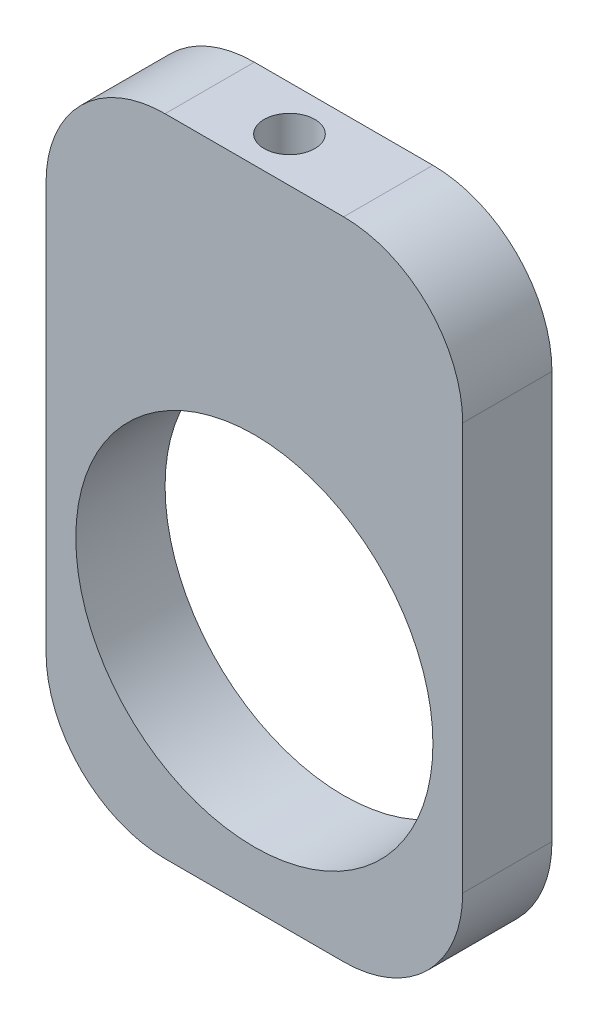
ISO-10303-21;
HEADER;
FILE_DESCRIPTION(('STEP AP214'),'2;1');
FILE_NAME('part.step','',(''),(''),'','','');
FILE_SCHEMA(('AUTOMOTIVE_DESIGN { 1 0 10303 214 1 1 1 1 }'));
ENDSEC;
DATA;
#1=APPLICATION_CONTEXT('core data for automotive mechanical design processes');
#2=APPLICATION_PROTOCOL_DEFINITION('international standard','automotive_design',2000,#1);
#3=PRODUCT_CONTEXT('',#1,'mechanical');
#4=PRODUCT('Part','Part','',(#3));
#5=PRODUCT_RELATED_PRODUCT_CATEGORY('part','',(#4));
#6=PRODUCT_DEFINITION_FORMATION('','',#4);
#7=PRODUCT_DEFINITION_CONTEXT('part definition',#1,'design');
#8=PRODUCT_DEFINITION('design','',#6,#7);
#9=PRODUCT_DEFINITION_SHAPE('','',#8);
#10=(LENGTH_UNIT() NAMED_UNIT(*) SI_UNIT(.MILLI.,.METRE.));
#11=(NAMED_UNIT(*) PLANE_ANGLE_UNIT() SI_UNIT($,.RADIAN.));
#12=(NAMED_UNIT(*) SI_UNIT($,.STERADIAN.) SOLID_ANGLE_UNIT());
#13=UNCERTAINTY_MEASURE_WITH_UNIT(LENGTH_MEASURE(1.E-05),#10,'distance_accuracy_value','');
#14=(GEOMETRIC_REPRESENTATION_CONTEXT(3) GLOBAL_UNCERTAINTY_ASSIGNED_CONTEXT((#13)) GLOBAL_UNIT_ASSIGNED_CONTEXT((#10,
#11,#12)) REPRESENTATION_CONTEXT('',''));
#15=CARTESIAN_POINT('',(0.,0.,0.));
#16=DIRECTION('',(0.,0.,1.));
#17=DIRECTION('',(1.,0.,0.));
#18=AXIS2_PLACEMENT_3D('',#15,#16,#17);
#19=CARTESIAN_POINT('',(0.,21.971,4.7625));
#20=DIRECTION('',(0.,-1.,0.));
#21=DIRECTION('',(1.,0.,0.));
#22=AXIS2_PLACEMENT_3D('',#19,#20,#21);
#23=PLANE('',#22);
#24=CARTESIAN_POINT('',(-0.508000000000001,21.971,2.38125));
#25=DIRECTION('',(0.,1.,0.));
#26=DIRECTION('',(0.,0.,1.));
#27=AXIS2_PLACEMENT_3D('',#24,#25,#26);
#28=CIRCLE('',#27,1.35255);
#29=CARTESIAN_POINT('',(-0.508000000000001,21.971,3.7338));
#30=VERTEX_POINT('',#29);
#31=EDGE_CURVE('E190',#30,#30,#28,.T.);
#32=ORIENTED_EDGE('',*,*,#31,.F.);
#33=EDGE_LOOP('',(#32));
#34=FACE_BOUND('',#33,.T.);
#35=DIRECTION('',(-1.,0.,0.));
#36=VECTOR('',#35,1.);
#37=CARTESIAN_POINT('',(0.,21.971,0.));
#38=LINE('',#37,#36);
#39=CARTESIAN_POINT('',(4.7625,21.971,0.));
#40=VERTEX_POINT('',#39);
#41=CARTESIAN_POINT('',(-4.7625,21.971,0.));
#42=VERTEX_POINT('',#41);
#43=EDGE_CURVE('E139',#40,#42,#38,.T.);
#44=ORIENTED_EDGE('',*,*,#43,.T.);
#45=DIRECTION('',(0.,0.,-1.));
#46=VECTOR('',#45,1.);
#47=CARTESIAN_POINT('',(-4.7625,21.971,4.7625));
#48=LINE('',#47,#46);
#49=CARTESIAN_POINT('',(-4.7625,21.971,4.7625));
#50=VERTEX_POINT('',#49);
#51=EDGE_CURVE('E11',#50,#42,#48,.T.);
#52=ORIENTED_EDGE('',*,*,#51,.F.);
#53=DIRECTION('',(-1.,0.,0.));
#54=VECTOR('',#53,1.);
#55=CARTESIAN_POINT('',(0.,21.971,4.7625));
#56=LINE('',#55,#54);
#57=CARTESIAN_POINT('',(4.7625,21.971,4.7625));
#58=VERTEX_POINT('',#57);
#59=EDGE_CURVE('E158',#58,#50,#56,.T.);
#60=ORIENTED_EDGE('',*,*,#59,.F.);
#61=DIRECTION('',(0.,0.,-1.));
#62=VECTOR('',#61,1.);
#63=CARTESIAN_POINT('',(4.7625,21.971,4.7625));
#64=LINE('',#63,#62);
#65=EDGE_CURVE('E138',#58,#40,#64,.T.);
#66=ORIENTED_EDGE('',*,*,#65,.T.);
#67=EDGE_LOOP('',(#44,#52,#60,#66));
#68=FACE_BOUND('',#67,.T.);
#69=ADVANCED_FACE('F35',(#34,#68),#23,.F.);
#70=CARTESIAN_POINT('',(-4.7625,15.621,4.7625));
#71=DIRECTION('',(0.,0.,-1.));
#72=DIRECTION('',(-1.,0.,0.));
#73=AXIS2_PLACEMENT_3D('',#70,#71,#72);
#74=CYLINDRICAL_SURFACE('',#73,6.35);
#75=CARTESIAN_POINT('',(-4.7625,15.621,0.));
#76=DIRECTION('',(0.,0.,1.));
#77=DIRECTION('',(1.,0.,0.));
#78=AXIS2_PLACEMENT_3D('',#75,#76,#77);
#79=CIRCLE('',#78,6.35);
#80=CARTESIAN_POINT('',(-11.1125,15.621,0.));
#81=VERTEX_POINT('',#80);
#82=EDGE_CURVE('E142',#42,#81,#79,.T.);
#83=ORIENTED_EDGE('',*,*,#82,.T.);
#84=DIRECTION('',(0.,0.,-1.));
#85=VECTOR('',#84,1.);
#86=CARTESIAN_POINT('',(-11.1125,15.621,4.7625));
#87=LINE('',#86,#85);
#88=CARTESIAN_POINT('',(-11.1125,15.621,4.7625));
#89=VERTEX_POINT('',#88);
#90=EDGE_CURVE('E48',#89,#81,#87,.T.);
#91=ORIENTED_EDGE('',*,*,#90,.F.);
#92=CARTESIAN_POINT('',(-4.7625,15.621,4.7625));
#93=DIRECTION('',(0.,0.,1.));
#94=DIRECTION('',(1.,0.,0.));
#95=AXIS2_PLACEMENT_3D('',#92,#93,#94);
#96=CIRCLE('',#95,6.35);
#97=EDGE_CURVE('E99',#50,#89,#96,.T.);
#98=ORIENTED_EDGE('',*,*,#97,.F.);
#99=ORIENTED_EDGE('',*,*,#51,.T.);
#100=EDGE_LOOP('',(#83,#91,#98,#99));
#101=FACE_BOUND('',#100,.T.);
#102=ADVANCED_FACE('F214',(#101),#74,.T.);
#103=CARTESIAN_POINT('',(-11.1125,0.,4.7625));
#104=DIRECTION('',(1.,0.,0.));
#105=DIRECTION('',(0.,0.,-1.));
#106=AXIS2_PLACEMENT_3D('',#103,#104,#105);
#107=PLANE('',#106);
#108=DIRECTION('',(0.,-1.,0.));
#109=VECTOR('',#108,1.);
#110=CARTESIAN_POINT('',(-11.1125,0.,0.));
#111=LINE('',#110,#109);
#112=CARTESIAN_POINT('',(-11.1125,-6.096,0.));
#113=VERTEX_POINT('',#112);
#114=EDGE_CURVE('E144',#81,#113,#111,.T.);
#115=ORIENTED_EDGE('',*,*,#114,.T.);
#116=DIRECTION('',(0.,0.,-1.));
#117=VECTOR('',#116,1.);
#118=CARTESIAN_POINT('',(-11.1125,-6.096,4.7625));
#119=LINE('',#118,#117);
#120=CARTESIAN_POINT('',(-11.1125,-6.096,4.7625));
#121=VERTEX_POINT('',#120);
#122=EDGE_CURVE('E164',#121,#113,#119,.T.);
#123=ORIENTED_EDGE('',*,*,#122,.F.);
#124=DIRECTION('',(0.,-1.,0.));
#125=VECTOR('',#124,1.);
#126=CARTESIAN_POINT('',(-11.1125,0.,4.7625));
#127=LINE('',#126,#125);
#128=EDGE_CURVE('E173',#89,#121,#127,.T.);
#129=ORIENTED_EDGE('',*,*,#128,.F.);
#130=ORIENTED_EDGE('',*,*,#90,.T.);
#131=EDGE_LOOP('',(#115,#123,#129,#130));
#132=FACE_BOUND('',#131,.T.);
#133=ADVANCED_FACE('F171',(#132),#107,.F.);
#134=CARTESIAN_POINT('',(-4.7625,-6.096,4.7625));
#135=DIRECTION('',(0.,0.,-1.));
#136=DIRECTION('',(-1.,0.,0.));
#137=AXIS2_PLACEMENT_3D('',#134,#135,#136);
#138=CYLINDRICAL_SURFACE('',#137,6.35);
#139=CARTESIAN_POINT('',(-4.7625,-6.096,0.));
#140=DIRECTION('',(0.,0.,1.));
#141=DIRECTION('',(1.,0.,0.));
#142=AXIS2_PLACEMENT_3D('',#139,#140,#141);
#143=CIRCLE('',#142,6.35);
#144=CARTESIAN_POINT('',(-4.7625,-12.446,0.));
#145=VERTEX_POINT('',#144);
#146=EDGE_CURVE('E146',#113,#145,#143,.T.);
#147=ORIENTED_EDGE('',*,*,#146,.T.);
#148=DIRECTION('',(0.,0.,-1.));
#149=VECTOR('',#148,1.);
#150=CARTESIAN_POINT('',(-4.7625,-12.446,4.7625));
#151=LINE('',#150,#149);
#152=CARTESIAN_POINT('',(-4.7625,-12.446,4.7625));
#153=VERTEX_POINT('',#152);
#154=EDGE_CURVE('E162',#153,#145,#151,.T.);
#155=ORIENTED_EDGE('',*,*,#154,.F.);
#156=CARTESIAN_POINT('',(-4.7625,-6.096,4.7625));
#157=DIRECTION('',(0.,0.,1.));
#158=DIRECTION('',(1.,0.,0.));
#159=AXIS2_PLACEMENT_3D('',#156,#157,#158);
#160=CIRCLE('',#159,6.35);
#161=EDGE_CURVE('E184',#121,#153,#160,.T.);
#162=ORIENTED_EDGE('',*,*,#161,.F.);
#163=ORIENTED_EDGE('',*,*,#122,.T.);
#164=EDGE_LOOP('',(#147,#155,#162,#163));
#165=FACE_BOUND('',#164,.T.);
#166=ADVANCED_FACE('F182',(#165),#138,.T.);
#167=CARTESIAN_POINT('',(0.,-12.446,4.7625));
#168=DIRECTION('',(0.,-1.,0.));
#169=DIRECTION('',(1.,0.,0.));
#170=AXIS2_PLACEMENT_3D('',#167,#168,#169);
#171=PLANE('',#170);
#172=DIRECTION('',(-1.,0.,0.));
#173=VECTOR('',#172,1.);
#174=CARTESIAN_POINT('',(0.,-12.446,0.));
#175=LINE('',#174,#173);
#176=CARTESIAN_POINT('',(4.7625,-12.446,0.));
#177=VERTEX_POINT('',#176);
#178=EDGE_CURVE('E149',#177,#145,#175,.T.);
#179=ORIENTED_EDGE('',*,*,#178,.F.);
#180=DIRECTION('',(0.,0.,-1.));
#181=VECTOR('',#180,1.);
#182=CARTESIAN_POINT('',(4.7625,-12.446,4.7625));
#183=LINE('',#182,#181);
#184=CARTESIAN_POINT('',(4.7625,-12.446,4.7625));
#185=VERTEX_POINT('',#184);
#186=EDGE_CURVE('E127',#185,#177,#183,.T.);
#187=ORIENTED_EDGE('',*,*,#186,.F.);
#188=DIRECTION('',(-1.,0.,0.));
#189=VECTOR('',#188,1.);
#190=CARTESIAN_POINT('',(0.,-12.446,4.7625));
#191=LINE('',#190,#189);
#192=EDGE_CURVE('E120',#185,#153,#191,.T.);
#193=ORIENTED_EDGE('',*,*,#192,.T.);
#194=ORIENTED_EDGE('',*,*,#154,.T.);
#195=EDGE_LOOP('',(#179,#187,#193,#194));
#196=FACE_BOUND('',#195,.T.);
#197=ADVANCED_FACE('F223',(#196),#171,.T.);
#198=CARTESIAN_POINT('',(4.7625,-6.096,4.7625));
#199=DIRECTION('',(0.,0.,-1.));
#200=DIRECTION('',(-1.,0.,0.));
#201=AXIS2_PLACEMENT_3D('',#198,#199,#200);
#202=CYLINDRICAL_SURFACE('',#201,6.35);
#203=CARTESIAN_POINT('',(4.7625,-6.096,0.));
#204=DIRECTION('',(0.,0.,1.));
#205=DIRECTION('',(1.,0.,0.));
#206=AXIS2_PLACEMENT_3D('',#203,#204,#205);
#207=CIRCLE('',#206,6.35);
#208=CARTESIAN_POINT('',(11.1125,-6.096,0.));
#209=VERTEX_POINT('',#208);
#210=EDGE_CURVE('E126',#177,#209,#207,.T.);
#211=ORIENTED_EDGE('',*,*,#210,.T.);
#212=DIRECTION('',(0.,0.,-1.));
#213=VECTOR('',#212,1.);
#214=CARTESIAN_POINT('',(11.1125,-6.096,4.7625));
#215=LINE('',#214,#213);
#216=CARTESIAN_POINT('',(11.1125,-6.096,4.7625));
#217=VERTEX_POINT('',#216);
#218=EDGE_CURVE('E123',#217,#209,#215,.T.);
#219=ORIENTED_EDGE('',*,*,#218,.F.);
#220=CARTESIAN_POINT('',(4.7625,-6.096,4.7625));
#221=DIRECTION('',(0.,0.,1.));
#222=DIRECTION('',(1.,0.,0.));
#223=AXIS2_PLACEMENT_3D('',#220,#221,#222);
#224=CIRCLE('',#223,6.35);
#225=EDGE_CURVE('E113',#185,#217,#224,.T.);
#226=ORIENTED_EDGE('',*,*,#225,.F.);
#227=ORIENTED_EDGE('',*,*,#186,.T.);
#228=EDGE_LOOP('',(#211,#219,#226,#227));
#229=FACE_BOUND('',#228,.T.);
#230=ADVANCED_FACE('F124',(#229),#202,.T.);
#231=CARTESIAN_POINT('',(11.1125,0.,4.7625));
#232=DIRECTION('',(-1.,0.,0.));
#233=DIRECTION('',(0.,0.,1.));
#234=AXIS2_PLACEMENT_3D('',#231,#232,#233);
#235=PLANE('',#234);
#236=DIRECTION('',(0.,1.,0.));
#237=VECTOR('',#236,1.);
#238=CARTESIAN_POINT('',(11.1125,0.,0.));
#239=LINE('',#238,#237);
#240=CARTESIAN_POINT('',(11.1125,15.621,0.));
#241=VERTEX_POINT('',#240);
#242=EDGE_CURVE('E85',#209,#241,#239,.T.);
#243=ORIENTED_EDGE('',*,*,#242,.T.);
#244=DIRECTION('',(0.,0.,-1.));
#245=VECTOR('',#244,1.);
#246=CARTESIAN_POINT('',(11.1125,15.621,4.7625));
#247=LINE('',#246,#245);
#248=CARTESIAN_POINT('',(11.1125,15.621,4.7625));
#249=VERTEX_POINT('',#248);
#250=EDGE_CURVE('E128',#249,#241,#247,.T.);
#251=ORIENTED_EDGE('',*,*,#250,.F.);
#252=DIRECTION('',(0.,1.,0.));
#253=VECTOR('',#252,1.);
#254=CARTESIAN_POINT('',(11.1125,0.,4.7625));
#255=LINE('',#254,#253);
#256=EDGE_CURVE('E118',#217,#249,#255,.T.);
#257=ORIENTED_EDGE('',*,*,#256,.F.);
#258=ORIENTED_EDGE('',*,*,#218,.T.);
#259=EDGE_LOOP('',(#243,#251,#257,#258));
#260=FACE_BOUND('',#259,.T.);
#261=ADVANCED_FACE('F130',(#260),#235,.F.);
#262=CARTESIAN_POINT('',(4.7625,15.621,4.7625));
#263=DIRECTION('',(0.,0.,-1.));
#264=DIRECTION('',(-1.,0.,0.));
#265=AXIS2_PLACEMENT_3D('',#262,#263,#264);
#266=CYLINDRICAL_SURFACE('',#265,6.35);
#267=CARTESIAN_POINT('',(4.7625,15.621,0.));
#268=DIRECTION('',(0.,0.,1.));
#269=DIRECTION('',(1.,0.,0.));
#270=AXIS2_PLACEMENT_3D('',#267,#268,#269);
#271=CIRCLE('',#270,6.35);
#272=EDGE_CURVE('E91',#241,#40,#271,.T.);
#273=ORIENTED_EDGE('',*,*,#272,.T.);
#274=ORIENTED_EDGE('',*,*,#65,.F.);
#275=CARTESIAN_POINT('',(4.7625,15.621,4.7625));
#276=DIRECTION('',(0.,0.,1.));
#277=DIRECTION('',(1.,0.,0.));
#278=AXIS2_PLACEMENT_3D('',#275,#276,#277);
#279=CIRCLE('',#278,6.35);
#280=EDGE_CURVE('E56',#249,#58,#279,.T.);
#281=ORIENTED_EDGE('',*,*,#280,.F.);
#282=ORIENTED_EDGE('',*,*,#250,.T.);
#283=EDGE_LOOP('',(#273,#274,#281,#282));
#284=FACE_BOUND('',#283,.T.);
#285=ADVANCED_FACE('F202',(#284),#266,.T.);
#286=CARTESIAN_POINT('',(0.,0.,4.7625));
#287=DIRECTION('',(0.,0.,-1.));
#288=DIRECTION('',(-1.,0.,0.));
#289=AXIS2_PLACEMENT_3D('',#286,#287,#288);
#290=CYLINDRICAL_SURFACE('',#289,9.525);
#291=CARTESIAN_POINT('',(-0.508000000000001,9.51144368642321,3.7338));
#292=CARTESIAN_POINT('',(-0.583998340709896,9.50738344092018,3.73379675725788));
#293=CARTESIAN_POINT('',(-0.659994965887937,9.50240257178552,3.72737282453337));
#294=CARTESIAN_POINT('',(-0.809768249064574,9.4908145366261,3.7018976896702));
#295=CARTESIAN_POINT('',(-0.883542407005971,9.48420561062706,3.68283278431164));
#296=CARTESIAN_POINT('',(-1.02668764399803,9.46977869754559,3.63268868720781));
#297=CARTESIAN_POINT('',(-1.09606268216843,9.46196182001787,3.60162048210455));
#298=CARTESIAN_POINT('',(-1.22857214094811,9.44567084346366,3.52837627806595));
#299=CARTESIAN_POINT('',(-1.29170754405546,9.43719684828367,3.48620203174175));
#300=CARTESIAN_POINT('',(-1.41055820452803,9.42016935645121,3.39149872586693));
#301=CARTESIAN_POINT('',(-1.46620532453974,9.41161580014575,3.33888412532557));
#302=CARTESIAN_POINT('',(-1.56788846370504,9.39521207936028,3.22496633248316));
#303=CARTESIAN_POINT('',(-1.61392407586861,9.38736194467402,3.16366277244096));
#304=CARTESIAN_POINT('',(-1.69506522290109,9.37305089259291,3.03402574683495));
#305=CARTESIAN_POINT('',(-1.73016744687643,9.36659039619694,2.96569016012211));
#306=CARTESIAN_POINT('',(-1.78834902346165,9.35565684755003,2.82393073151097));
#307=CARTESIAN_POINT('',(-1.81142966384804,9.35118358243038,2.75050743557357));
#308=CARTESIAN_POINT('',(-1.84457607507559,9.34470158035686,2.60185447571462));
#309=CARTESIAN_POINT('',(-1.85483527933739,9.34265623832473,2.52666954105912));
#310=CARTESIAN_POINT('',(-1.86265043147298,9.34110141389907,2.37561945877611));
#311=CARTESIAN_POINT('',(-1.86020750441516,9.34159170691622,2.29975437198602));
#312=CARTESIAN_POINT('',(-1.84281293307701,9.34503826554237,2.15051482181504));
#313=CARTESIAN_POINT('',(-1.82802076264047,9.34796309101977,2.07712095399505));
#314=CARTESIAN_POINT('',(-1.78659721895705,9.35596796254923,1.93388014662741));
#315=CARTESIAN_POINT('',(-1.75996543223475,9.36104808387049,1.86403333104853));
#316=CARTESIAN_POINT('',(-1.69545550049162,9.37294684917176,1.72936798021218));
#317=CARTESIAN_POINT('',(-1.65750823932272,9.37977614001881,1.66458352803657));
#318=CARTESIAN_POINT('',(-1.57151424515011,9.3945657604903,1.54225021807681));
#319=CARTESIAN_POINT('',(-1.52346649776159,9.40252620368955,1.48470208795987));
#320=CARTESIAN_POINT('',(-1.41768377570824,9.41906075552838,1.37743898864142));
#321=CARTESIAN_POINT('',(-1.35979753414636,9.42764301590282,1.32787438609865));
#322=CARTESIAN_POINT('',(-1.23651469116085,9.44460281838558,1.23913494423453));
#323=CARTESIAN_POINT('',(-1.17111772217023,9.45298035045036,1.19996061371278));
#324=CARTESIAN_POINT('',(-1.0341078852586,9.46895084516524,1.13286682774659));
#325=CARTESIAN_POINT('',(-0.962454283175306,9.47653783249448,1.10502902877401));
#326=CARTESIAN_POINT('',(-0.815347212892982,9.49032595258701,1.06185457223598));
#327=CARTESIAN_POINT('',(-0.739893963493159,9.49652716503732,1.04651719571718));
#328=CARTESIAN_POINT('',(-0.588034904156311,9.50713315086925,1.02892737909958));
#329=CARTESIAN_POINT('',(-0.511643513037602,9.51155339518235,1.02655989685422));
#330=CARTESIAN_POINT('',(-0.359468104526796,9.51851924130102,1.03472308728916));
#331=CARTESIAN_POINT('',(-0.283684048574456,9.52106496306944,1.0452529344708));
#332=CARTESIAN_POINT('',(-0.135717726797894,9.52431774948881,1.0787556036182));
#333=CARTESIAN_POINT('',(-0.0635060133445982,9.52504382519163,1.10159671403792));
#334=CARTESIAN_POINT('',(0.0760997863513471,9.52495201203383,1.15899184465722));
#335=CARTESIAN_POINT('',(0.143493848483644,9.52413411544684,1.1935459234704));
#336=CARTESIAN_POINT('',(0.271590772515359,9.5213431629876,1.27340124141226));
#337=CARTESIAN_POINT('',(0.332290844435313,9.51936962760427,1.31870693708309));
#338=CARTESIAN_POINT('',(0.445281350204275,9.51475450474678,1.41878323759454));
#339=CARTESIAN_POINT('',(0.497571447587269,9.51211289055501,1.47355422094034));
#340=CARTESIAN_POINT('',(0.592604524920071,9.50666773623774,1.59142139881013));
#341=CARTESIAN_POINT('',(0.635283005115768,9.50386325228141,1.6545695674542));
#342=CARTESIAN_POINT('',(0.709453611880632,9.49861509758127,1.78713951980705));
#343=CARTESIAN_POINT('',(0.740945699300263,9.49617142810023,1.85656132547089));
#344=CARTESIAN_POINT('',(0.791884816194872,9.49205994362047,1.99983215479813));
#345=CARTESIAN_POINT('',(0.81131385209113,9.49039328855574,2.07368761273174));
#346=CARTESIAN_POINT('',(0.837488152506661,9.4881196131537,2.22362824490617));
#347=CARTESIAN_POINT('',(0.844233725584903,9.48751256703861,2.29971336485879));
#348=CARTESIAN_POINT('',(0.844843404384771,9.48745827484814,2.45165985136868));
#349=CARTESIAN_POINT('',(0.838753927199795,9.48800684954414,2.5275210340531));
#350=CARTESIAN_POINT('',(0.813965073879225,9.490165346758,2.67713833006929));
#351=CARTESIAN_POINT('',(0.795265637719436,9.49177527432797,2.75089443337901));
#352=CARTESIAN_POINT('',(0.745802106963525,9.49578934593099,2.89419865480885));
#353=CARTESIAN_POINT('',(0.715040959475707,9.4981932959333,2.96374779605274));
#354=CARTESIAN_POINT('',(0.642326791357558,9.50338697512516,3.09670887861132));
#355=CARTESIAN_POINT('',(0.600373780035837,9.50617670399385,3.16012082503044));
#356=CARTESIAN_POINT('',(0.506281533700018,9.51165214158847,3.27925141319459));
#357=CARTESIAN_POINT('',(0.454106391391516,9.51433744244018,3.33494171807929));
#358=CARTESIAN_POINT('',(0.341116748537621,9.51905742435072,3.43679613424563));
#359=CARTESIAN_POINT('',(0.28030053447758,9.52109197610597,3.4829583516547));
#360=CARTESIAN_POINT('',(0.15178820119767,9.52400711336224,3.56440598193297));
#361=CARTESIAN_POINT('',(0.0840947996174279,9.52488815279696,3.59969566921042));
#362=CARTESIAN_POINT('',(-0.0562123487292912,9.52509144335766,3.65837549954538));
#363=CARTESIAN_POINT('',(-0.128820744771649,9.52441536397646,3.68177835444291));
#364=CARTESIAN_POINT('',(-0.252834107136902,9.52177590361097,3.71050713052897));
#365=CARTESIAN_POINT('',(-0.303488755441603,9.52030045294822,3.71923302482152));
#366=CARTESIAN_POINT('',(-0.405429199469644,9.51650430345193,3.7308805313999));
#367=CARTESIAN_POINT('',(-0.45671499034311,9.51418361110955,3.7338021882591));
#368=CARTESIAN_POINT('',(-0.508000000000001,9.51144368642321,3.7338));
#369=B_SPLINE_CURVE_WITH_KNOTS('',3,(#291,#292,#293,#294,#295,#296,#297,#298,#299,#300,#301,
#302,#303,#304,#305,#306,#307,#308,#309,#310,#311,#312,#313,#314,#315,#316,#317,#318,#319,#320,
#321,#322,#323,#324,#325,#326,#327,#328,#329,#330,#331,#332,#333,#334,#335,#336,#337,#338,#339,
#340,#341,#342,#343,#344,#345,#346,#347,#348,#349,#350,#351,#352,#353,#354,#355,#356,#357,#358,
#359,#360,#361,#362,#363,#364,#365,#366,#367,#368),.UNSPECIFIED.,.T.,.F.,(4,2,2,2,2,2,2,2,2,2,2,
2,2,2,2,2,2,2,2,2,2,2,2,2,2,2,2,2,2,2,2,2,2,2,2,2,2,2,4),(0.,0.228131184923087,
0.456510076573942,0.684680425949505,0.912814789999671,1.14290184325387,1.37299863734723,
1.60316504270567,1.8333067870966,2.05993280611719,2.28653875248843,2.5102628534884,
2.73399476822807,2.95912227505713,3.18427240209594,3.41326322071102,3.64226525067234,
3.87288877572271,4.10349903568075,4.33206044464052,4.56060722520129,4.78675608017555,
5.01290606685205,5.23914995686842,5.46540289619329,5.69313166105958,5.92086122291094,
6.14892966144281,6.3769925515315,6.60423208295556,6.83147269606165,7.05865782070645,
7.28584275639515,7.51384051547763,7.7418835495182,7.96983681636512,8.19754579282679,
8.35149388907399,8.50544080307938),.UNSPECIFIED.);
#370=CARTESIAN_POINT('',(-0.508000000000001,9.51144368642321,3.7338));
#371=VERTEX_POINT('',#370);
#372=EDGE_CURVE('E38',#371,#371,#369,.T.);
#373=ORIENTED_EDGE('',*,*,#372,.F.);
#374=EDGE_LOOP('',(#373));
#375=FACE_BOUND('',#374,.T.);
#376=CARTESIAN_POINT('',(0.,0.,4.7625));
#377=DIRECTION('',(0.,0.,1.));
#378=DIRECTION('',(1.,0.,0.));
#379=AXIS2_PLACEMENT_3D('',#376,#377,#378);
#380=CIRCLE('',#379,9.525);
#381=CARTESIAN_POINT('',(9.525,0.,4.7625));
#382=VERTEX_POINT('',#381);
#383=EDGE_CURVE('E132',#382,#382,#380,.T.);
#384=ORIENTED_EDGE('',*,*,#383,.T.);
#385=EDGE_LOOP('',(#384));
#386=FACE_BOUND('',#385,.T.);
#387=CARTESIAN_POINT('',(0.,0.,0.));
#388=DIRECTION('',(0.,0.,1.));
#389=DIRECTION('',(1.,0.,0.));
#390=AXIS2_PLACEMENT_3D('',#387,#388,#389);
#391=CIRCLE('',#390,9.525);
#392=CARTESIAN_POINT('',(9.525,0.,0.));
#393=VERTEX_POINT('',#392);
#394=EDGE_CURVE('E155',#393,#393,#391,.T.);
#395=ORIENTED_EDGE('',*,*,#394,.F.);
#396=EDGE_LOOP('',(#395));
#397=FACE_BOUND('',#396,.T.);
#398=ADVANCED_FACE('F199',(#375,#386,#397),#290,.F.);
#399=CARTESIAN_POINT('',(0.,0.,4.7625));
#400=DIRECTION('',(0.,0.,1.));
#401=DIRECTION('',(1.,0.,0.));
#402=AXIS2_PLACEMENT_3D('',#399,#400,#401);
#403=PLANE('',#402);
#404=ORIENTED_EDGE('',*,*,#59,.T.);
#405=ORIENTED_EDGE('',*,*,#97,.T.);
#406=ORIENTED_EDGE('',*,*,#128,.T.);
#407=ORIENTED_EDGE('',*,*,#161,.T.);
#408=ORIENTED_EDGE('',*,*,#192,.F.);
#409=ORIENTED_EDGE('',*,*,#225,.T.);
#410=ORIENTED_EDGE('',*,*,#256,.T.);
#411=ORIENTED_EDGE('',*,*,#280,.T.);
#412=EDGE_LOOP('',(#404,#405,#406,#407,#408,#409,#410,#411));
#413=FACE_BOUND('',#412,.T.);
#414=ORIENTED_EDGE('',*,*,#383,.F.);
#415=EDGE_LOOP('',(#414));
#416=FACE_BOUND('',#415,.T.);
#417=ADVANCED_FACE('F115',(#413,#416),#403,.T.);
#418=CARTESIAN_POINT('',(0.,0.,0.));
#419=DIRECTION('',(0.,0.,1.));
#420=DIRECTION('',(1.,0.,0.));
#421=AXIS2_PLACEMENT_3D('',#418,#419,#420);
#422=PLANE('',#421);
#423=ORIENTED_EDGE('',*,*,#43,.F.);
#424=ORIENTED_EDGE('',*,*,#272,.F.);
#425=ORIENTED_EDGE('',*,*,#242,.F.);
#426=ORIENTED_EDGE('',*,*,#210,.F.);
#427=ORIENTED_EDGE('',*,*,#178,.T.);
#428=ORIENTED_EDGE('',*,*,#146,.F.);
#429=ORIENTED_EDGE('',*,*,#114,.F.);
#430=ORIENTED_EDGE('',*,*,#82,.F.);
#431=EDGE_LOOP('',(#423,#424,#425,#426,#427,#428,#429,#430));
#432=FACE_BOUND('',#431,.T.);
#433=ORIENTED_EDGE('',*,*,#394,.T.);
#434=EDGE_LOOP('',(#433));
#435=FACE_BOUND('',#434,.T.);
#436=ADVANCED_FACE('F177',(#432,#435),#422,.F.);
#437=CARTESIAN_POINT('',(-0.508000000000001,21.971,2.38125));
#438=DIRECTION('',(0.,1.,0.));
#439=DIRECTION('',(0.,0.,1.));
#440=AXIS2_PLACEMENT_3D('',#437,#438,#439);
#441=CYLINDRICAL_SURFACE('',#440,1.35255);
#442=ORIENTED_EDGE('',*,*,#372,.T.);
#443=EDGE_LOOP('',(#442));
#444=FACE_BOUND('',#443,.T.);
#445=ORIENTED_EDGE('',*,*,#31,.T.);
#446=EDGE_LOOP('',(#445));
#447=FACE_BOUND('',#446,.T.);
#448=ADVANCED_FACE('F197',(#444,#447),#441,.F.);
#449=CLOSED_SHELL('',(#69,#102,#133,#166,#197,#230,#261,#285,#398,#417,#436,#448));
#450=MANIFOLD_SOLID_BREP('B2',#449);
#451=ADVANCED_BREP_SHAPE_REPRESENTATION('',(#18,#450),#14);
#452=SHAPE_DEFINITION_REPRESENTATION(#9,#451);
ENDSEC;
END-ISO-10303-21;
